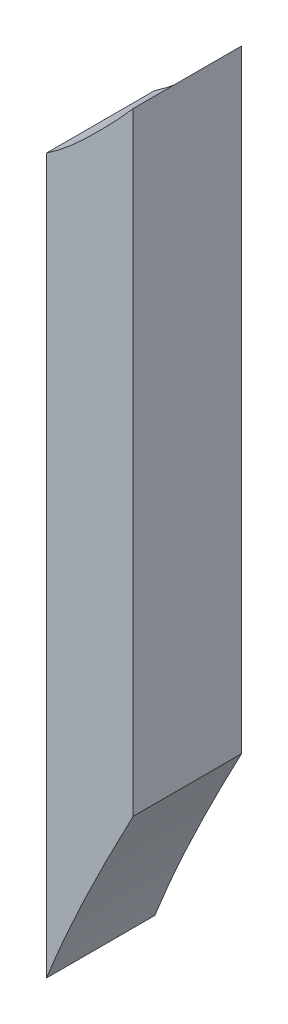
ISO-10303-21;
HEADER;
FILE_DESCRIPTION(('STEP AP214'),'2;1');
FILE_NAME('part.step','',(''),(''),'','','');
FILE_SCHEMA(('AUTOMOTIVE_DESIGN { 1 0 10303 214 1 1 1 1 }'));
ENDSEC;
DATA;
#1=APPLICATION_CONTEXT('core data for automotive mechanical design processes');
#2=APPLICATION_PROTOCOL_DEFINITION('international standard','automotive_design',2000,#1);
#3=PRODUCT_CONTEXT('',#1,'mechanical');
#4=PRODUCT('Part','Part','',(#3));
#5=PRODUCT_RELATED_PRODUCT_CATEGORY('part','',(#4));
#6=PRODUCT_DEFINITION_FORMATION('','',#4);
#7=PRODUCT_DEFINITION_CONTEXT('part definition',#1,'design');
#8=PRODUCT_DEFINITION('design','',#6,#7);
#9=PRODUCT_DEFINITION_SHAPE('','',#8);
#10=(LENGTH_UNIT() NAMED_UNIT(*) SI_UNIT(.MILLI.,.METRE.));
#11=(NAMED_UNIT(*) PLANE_ANGLE_UNIT() SI_UNIT($,.RADIAN.));
#12=(NAMED_UNIT(*) SI_UNIT($,.STERADIAN.) SOLID_ANGLE_UNIT());
#13=UNCERTAINTY_MEASURE_WITH_UNIT(LENGTH_MEASURE(1.E-05),#10,'distance_accuracy_value','');
#14=(GEOMETRIC_REPRESENTATION_CONTEXT(3) GLOBAL_UNCERTAINTY_ASSIGNED_CONTEXT((#13)) GLOBAL_UNIT_ASSIGNED_CONTEXT((#10,
#11,#12)) REPRESENTATION_CONTEXT('',''));
#15=CARTESIAN_POINT('',(0.,0.,0.));
#16=DIRECTION('',(0.,0.,1.));
#17=DIRECTION('',(1.,0.,0.));
#18=AXIS2_PLACEMENT_3D('',#15,#16,#17);
#19=CARTESIAN_POINT('',(69.787127385813,-67.1327391771495,51.9999999999997));
#20=CARTESIAN_POINT('',(70.7008849742523,-64.8025006125268,51.9999999999997));
#21=CARTESIAN_POINT('',(71.7203022283385,-62.5222245818766,51.9999999999997));
#22=CARTESIAN_POINT('',(73.8802199083498,-58.0189282581318,51.9999999999997));
#23=CARTESIAN_POINT('',(75.0211423806794,-55.7961075351162,51.9999999999997));
#24=CARTESIAN_POINT('',(76.1901200621039,-53.5865530791186,51.9999999999997));
#25=B_SPLINE_CURVE_WITH_KNOTS('',3,(#19,#20,#21,#22,#23,#24),.UNSPECIFIED.,.F.,.F.,(4,2,4),(0.,
0.499999999999999,1.),.UNSPECIFIED.);
#26=DIRECTION('',(0.,0.,-1.));
#27=VECTOR('',#26,1.);
#28=SURFACE_OF_LINEAR_EXTRUSION('',#25,#27);
#29=CARTESIAN_POINT('',(69.787127385813,-67.1327391771495,43.9999999999997));
#30=CARTESIAN_POINT('',(70.7008849742523,-64.8025006125268,43.9999999999997));
#31=CARTESIAN_POINT('',(71.7203022283385,-62.5222245818766,43.9999999999997));
#32=CARTESIAN_POINT('',(73.8802199083498,-58.0189282581318,43.9999999999997));
#33=CARTESIAN_POINT('',(75.0211423806794,-55.7961075351162,43.9999999999997));
#34=CARTESIAN_POINT('',(76.1901200621039,-53.5865530791186,43.9999999999997));
#35=B_SPLINE_CURVE_WITH_KNOTS('',3,(#29,#30,#31,#32,#33,#34),.UNSPECIFIED.,.F.,.F.,(4,2,4),(0.,
0.499999999999999,1.),.UNSPECIFIED.);
#36=CARTESIAN_POINT('',(69.7871273858131,-67.1327391771493,43.9999999999997));
#37=VERTEX_POINT('',#36);
#38=CARTESIAN_POINT('',(76.1901200621127,-53.5865530790992,43.9999999999997));
#39=VERTEX_POINT('',#38);
#40=EDGE_CURVE('E188',#37,#39,#35,.T.);
#41=ORIENTED_EDGE('',*,*,#40,.T.);
#42=DIRECTION('',(0.,0.,-1.));
#43=VECTOR('',#42,1.);
#44=CARTESIAN_POINT('',(76.1901200621127,-53.5865530790992,51.9999999999997));
#45=LINE('',#44,#43);
#46=CARTESIAN_POINT('',(76.1901200621127,-53.5865530790992,51.9999999999997));
#47=VERTEX_POINT('',#46);
#48=EDGE_CURVE('E11',#47,#39,#45,.T.);
#49=ORIENTED_EDGE('',*,*,#48,.F.);
#50=CARTESIAN_POINT('',(76.1901200621039,-53.5865530791186,51.9999999999997));
#51=CARTESIAN_POINT('',(75.0211423806794,-55.7961075351162,51.9999999999997));
#52=CARTESIAN_POINT('',(73.8802199083498,-58.0189282581318,51.9999999999997));
#53=CARTESIAN_POINT('',(71.7203022283385,-62.5222245818766,51.9999999999997));
#54=CARTESIAN_POINT('',(70.7008849742523,-64.8025006125268,51.9999999999997));
#55=CARTESIAN_POINT('',(69.787127385813,-67.1327391771495,51.9999999999997));
#56=B_SPLINE_CURVE_WITH_KNOTS('',3,(#50,#51,#52,#53,#54,#55),.UNSPECIFIED.,.F.,.F.,(4,2,4),(0.,
0.500000000000001,1.),.UNSPECIFIED.);
#57=CARTESIAN_POINT('',(69.7871273858131,-67.1327391771493,51.9999999999997));
#58=VERTEX_POINT('',#57);
#59=EDGE_CURVE('E89',#58,#47,#56,.F.);
#60=ORIENTED_EDGE('',*,*,#59,.F.);
#61=DIRECTION('',(0.,0.,-1.));
#62=VECTOR('',#61,1.);
#63=CARTESIAN_POINT('',(69.7871273858131,-67.1327391771493,51.9999999999997));
#64=LINE('',#63,#62);
#65=EDGE_CURVE('E174',#58,#37,#64,.T.);
#66=ORIENTED_EDGE('',*,*,#65,.T.);
#67=EDGE_LOOP('',(#41,#49,#60,#66));
#68=FACE_BOUND('',#67,.T.);
#69=ADVANCED_FACE('F30',(#68),#28,.F.);
#70=CARTESIAN_POINT('',(76.1901200621127,-53.5865530790992,51.9999999999997));
#71=DIRECTION('',(-1.,-1.94597686304278E-13,0.));
#72=DIRECTION('',(1.94597686304278E-13,-1.,0.));
#73=AXIS2_PLACEMENT_3D('',#70,#71,#72);
#74=PLANE('',#73);
#75=DIRECTION('',(-1.94597686304278E-13,1.,0.));
#76=VECTOR('',#75,1.);
#77=CARTESIAN_POINT('',(76.1901200621127,-53.5865530790992,43.9999999999997));
#78=LINE('',#77,#76);
#79=CARTESIAN_POINT('',(76.1901200621039,-8.30135249257796,43.9999999999997));
#80=VERTEX_POINT('',#79);
#81=EDGE_CURVE('E94',#39,#80,#78,.T.);
#82=ORIENTED_EDGE('',*,*,#81,.T.);
#83=DIRECTION('',(0.,0.,-1.));
#84=VECTOR('',#83,1.);
#85=CARTESIAN_POINT('',(76.1901200621039,-8.30135249257796,51.9999999999997));
#86=LINE('',#85,#84);
#87=CARTESIAN_POINT('',(76.1901200621039,-8.30135249257796,51.9999999999997));
#88=VERTEX_POINT('',#87);
#89=EDGE_CURVE('E43',#88,#80,#86,.T.);
#90=ORIENTED_EDGE('',*,*,#89,.F.);
#91=DIRECTION('',(-1.94597686304278E-13,1.,0.));
#92=VECTOR('',#91,1.);
#93=CARTESIAN_POINT('',(76.1901200621127,-53.5865530790992,51.9999999999997));
#94=LINE('',#93,#92);
#95=EDGE_CURVE('E83',#47,#88,#94,.T.);
#96=ORIENTED_EDGE('',*,*,#95,.F.);
#97=ORIENTED_EDGE('',*,*,#48,.T.);
#98=EDGE_LOOP('',(#82,#90,#96,#97));
#99=FACE_BOUND('',#98,.T.);
#100=ADVANCED_FACE('F93',(#99),#74,.F.);
#101=CARTESIAN_POINT('',(76.1901200621038,-8.30135249257803,51.9999999999997));
#102=CARTESIAN_POINT('',(75.7155136570845,-8.8639403631609,51.9999999999997));
#103=CARTESIAN_POINT('',(75.2175442126188,-9.40587789956777,51.9999999999997));
#104=CARTESIAN_POINT('',(74.1966138129047,-10.4676632502626,51.9999999999997));
#105=CARTESIAN_POINT('',(73.6786249338195,-10.9926499694425,51.9999999999997));
#106=CARTESIAN_POINT('',(72.628961747965,-12.0253142461074,51.9999999999997));
#107=CARTESIAN_POINT('',(72.094756114415,-12.5305310806625,51.9999999999997));
#108=CARTESIAN_POINT('',(70.9811112045927,-13.4873287884984,51.9999999999997));
#109=CARTESIAN_POINT('',(70.4043349028667,-13.9420672938215,51.9999999999997));
#110=CARTESIAN_POINT('',(69.7871273858129,-14.3488643341404,51.9999999999997));
#111=B_SPLINE_CURVE_WITH_KNOTS('',3,(#101,#102,#103,#104,#105,#106,#107,#108,#109,#110),
.UNSPECIFIED.,.F.,.F.,(4,2,2,2,4),(0.,0.25,0.5,0.75,1.),.UNSPECIFIED.);
#112=DIRECTION('',(0.,0.,-1.));
#113=VECTOR('',#112,1.);
#114=SURFACE_OF_LINEAR_EXTRUSION('',#111,#113);
#115=CARTESIAN_POINT('',(76.1901200621038,-8.30135249257803,43.9999999999997));
#116=CARTESIAN_POINT('',(75.7155136570845,-8.8639403631609,43.9999999999997));
#117=CARTESIAN_POINT('',(75.2175442126188,-9.40587789956777,43.9999999999997));
#118=CARTESIAN_POINT('',(74.1966138129047,-10.4676632502626,43.9999999999997));
#119=CARTESIAN_POINT('',(73.6786249338195,-10.9926499694425,43.9999999999997));
#120=CARTESIAN_POINT('',(72.628961747965,-12.0253142461074,43.9999999999997));
#121=CARTESIAN_POINT('',(72.094756114415,-12.5305310806625,43.9999999999997));
#122=CARTESIAN_POINT('',(70.9811112045927,-13.4873287884984,43.9999999999997));
#123=CARTESIAN_POINT('',(70.4043349028667,-13.9420672938215,43.9999999999997));
#124=CARTESIAN_POINT('',(69.7871273858129,-14.3488643341404,43.9999999999997));
#125=B_SPLINE_CURVE_WITH_KNOTS('',3,(#115,#116,#117,#118,#119,#120,#121,#122,#123,#124),
.UNSPECIFIED.,.F.,.F.,(4,2,2,2,4),(0.,0.25,0.5,0.75,1.),.UNSPECIFIED.);
#126=CARTESIAN_POINT('',(69.7871273858129,-14.3488643341404,43.9999999999997));
#127=VERTEX_POINT('',#126);
#128=EDGE_CURVE('E69',#80,#127,#125,.T.);
#129=ORIENTED_EDGE('',*,*,#128,.T.);
#130=DIRECTION('',(0.,0.,-1.));
#131=VECTOR('',#130,1.);
#132=CARTESIAN_POINT('',(69.7871273858129,-14.3488643341404,51.9999999999997));
#133=LINE('',#132,#131);
#134=CARTESIAN_POINT('',(69.7871273858129,-14.3488643341404,51.9999999999997));
#135=VERTEX_POINT('',#134);
#136=EDGE_CURVE('E95',#135,#127,#133,.T.);
#137=ORIENTED_EDGE('',*,*,#136,.F.);
#138=CARTESIAN_POINT('',(69.7871273858129,-14.3488643341404,51.9999999999997));
#139=CARTESIAN_POINT('',(70.4043349028667,-13.9420672938215,51.9999999999997));
#140=CARTESIAN_POINT('',(70.9811112045927,-13.4873287884984,51.9999999999997));
#141=CARTESIAN_POINT('',(72.094756114415,-12.5305310806625,51.9999999999997));
#142=CARTESIAN_POINT('',(72.628961747965,-12.0253142461074,51.9999999999997));
#143=CARTESIAN_POINT('',(73.6786249338195,-10.9926499694425,51.9999999999997));
#144=CARTESIAN_POINT('',(74.1966138129047,-10.4676632502626,51.9999999999997));
#145=CARTESIAN_POINT('',(75.2175442126188,-9.40587789956777,51.9999999999997));
#146=CARTESIAN_POINT('',(75.7155136570845,-8.8639403631609,51.9999999999997));
#147=CARTESIAN_POINT('',(76.1901200621038,-8.30135249257803,51.9999999999997));
#148=B_SPLINE_CURVE_WITH_KNOTS('',3,(#138,#139,#140,#141,#142,#143,#144,#145,#146,#147),
.UNSPECIFIED.,.F.,.F.,(4,2,2,2,4),(0.,0.25,0.5,0.75,1.),.UNSPECIFIED.);
#149=EDGE_CURVE('E86',#88,#135,#148,.F.);
#150=ORIENTED_EDGE('',*,*,#149,.F.);
#151=ORIENTED_EDGE('',*,*,#89,.T.);
#152=EDGE_LOOP('',(#129,#137,#150,#151));
#153=FACE_BOUND('',#152,.T.);
#154=ADVANCED_FACE('F98',(#153),#114,.F.);
#155=CARTESIAN_POINT('',(69.7871273858131,-67.1327391771493,51.9999999999997));
#156=DIRECTION('',(1.,0.,0.));
#157=DIRECTION('',(0.,1.,0.));
#158=AXIS2_PLACEMENT_3D('',#155,#156,#157);
#159=PLANE('',#158);
#160=DIRECTION('',(0.,-1.,0.));
#161=VECTOR('',#160,1.);
#162=CARTESIAN_POINT('',(69.7871273858131,-67.1327391771493,43.9999999999997));
#163=LINE('',#162,#161);
#164=EDGE_CURVE('E76',#127,#37,#163,.T.);
#165=ORIENTED_EDGE('',*,*,#164,.T.);
#166=ORIENTED_EDGE('',*,*,#65,.F.);
#167=DIRECTION('',(0.,-1.,0.));
#168=VECTOR('',#167,1.);
#169=CARTESIAN_POINT('',(69.7871273858131,-67.1327391771493,51.9999999999997));
#170=LINE('',#169,#168);
#171=EDGE_CURVE('E52',#135,#58,#170,.T.);
#172=ORIENTED_EDGE('',*,*,#171,.F.);
#173=ORIENTED_EDGE('',*,*,#136,.T.);
#174=EDGE_LOOP('',(#165,#166,#172,#173));
#175=FACE_BOUND('',#174,.T.);
#176=ADVANCED_FACE('F117',(#175),#159,.F.);
#177=CARTESIAN_POINT('',(72.8002610683441,-60.2705764200042,51.9999999999997));
#178=DIRECTION('',(0.,0.,-1.));
#179=DIRECTION('',(-1.,0.,0.));
#180=AXIS2_PLACEMENT_3D('',#177,#178,#179);
#181=PLANE('',#180);
#182=ORIENTED_EDGE('',*,*,#59,.T.);
#183=ORIENTED_EDGE('',*,*,#95,.T.);
#184=ORIENTED_EDGE('',*,*,#149,.T.);
#185=ORIENTED_EDGE('',*,*,#171,.T.);
#186=EDGE_LOOP('',(#182,#183,#184,#185));
#187=FACE_BOUND('',#186,.T.);
#188=ADVANCED_FACE('F84',(#187),#181,.F.);
#189=CARTESIAN_POINT('',(72.8002610683441,-60.2705764200042,43.9999999999997));
#190=DIRECTION('',(0.,0.,-1.));
#191=DIRECTION('',(-1.,0.,0.));
#192=AXIS2_PLACEMENT_3D('',#189,#190,#191);
#193=PLANE('',#192);
#194=ORIENTED_EDGE('',*,*,#40,.F.);
#195=ORIENTED_EDGE('',*,*,#164,.F.);
#196=ORIENTED_EDGE('',*,*,#128,.F.);
#197=ORIENTED_EDGE('',*,*,#81,.F.);
#198=EDGE_LOOP('',(#194,#195,#196,#197));
#199=FACE_BOUND('',#198,.T.);
#200=ADVANCED_FACE('F147',(#199),#193,.T.);
#201=CLOSED_SHELL('',(#69,#100,#154,#176,#188,#200));
#202=MANIFOLD_SOLID_BREP('B2',#201);
#203=ADVANCED_BREP_SHAPE_REPRESENTATION('',(#18,#202),#14);
#204=SHAPE_DEFINITION_REPRESENTATION(#9,#203);
ENDSEC;
END-ISO-10303-21;
